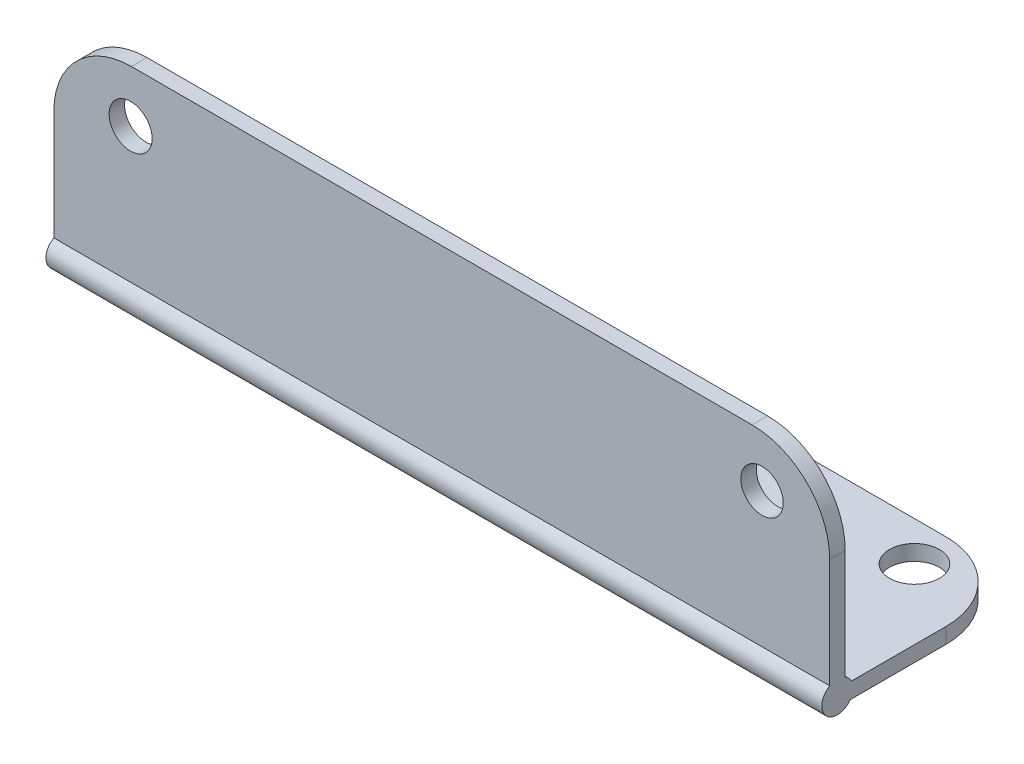
ISO-10303-21;
HEADER;
FILE_DESCRIPTION(('STEP AP214'),'2;1');
FILE_NAME('part.step','',(''),(''),'','','');
FILE_SCHEMA(('AUTOMOTIVE_DESIGN { 1 0 10303 214 1 1 1 1 }'));
ENDSEC;
DATA;
#1=APPLICATION_CONTEXT('core data for automotive mechanical design processes');
#2=APPLICATION_PROTOCOL_DEFINITION('international standard','automotive_design',2000,#1);
#3=PRODUCT_CONTEXT('',#1,'mechanical');
#4=PRODUCT('Part','Part','',(#3));
#5=PRODUCT_RELATED_PRODUCT_CATEGORY('part','',(#4));
#6=PRODUCT_DEFINITION_FORMATION('','',#4);
#7=PRODUCT_DEFINITION_CONTEXT('part definition',#1,'design');
#8=PRODUCT_DEFINITION('design','',#6,#7);
#9=PRODUCT_DEFINITION_SHAPE('','',#8);
#10=(LENGTH_UNIT() NAMED_UNIT(*) SI_UNIT(.MILLI.,.METRE.));
#11=(NAMED_UNIT(*) PLANE_ANGLE_UNIT() SI_UNIT($,.RADIAN.));
#12=(NAMED_UNIT(*) SI_UNIT($,.STERADIAN.) SOLID_ANGLE_UNIT());
#13=UNCERTAINTY_MEASURE_WITH_UNIT(LENGTH_MEASURE(1.E-05),#10,'distance_accuracy_value','');
#14=(GEOMETRIC_REPRESENTATION_CONTEXT(3) GLOBAL_UNCERTAINTY_ASSIGNED_CONTEXT((#13)) GLOBAL_UNIT_ASSIGNED_CONTEXT((#10,
#11,#12)) REPRESENTATION_CONTEXT('',''));
#15=CARTESIAN_POINT('',(0.,0.,0.));
#16=DIRECTION('',(0.,0.,1.));
#17=DIRECTION('',(1.,0.,0.));
#18=AXIS2_PLACEMENT_3D('',#15,#16,#17);
#19=CARTESIAN_POINT('',(25.4,-2.54,0.508));
#20=DIRECTION('',(-1.,0.,0.));
#21=DIRECTION('',(0.,0.,1.));
#22=AXIS2_PLACEMENT_3D('',#19,#20,#21);
#23=PLANE('',#22);
#24=DIRECTION('',(0.,0.,1.));
#25=VECTOR('',#24,1.);
#26=CARTESIAN_POINT('',(25.4,-6.35,0.508));
#27=LINE('',#26,#25);
#28=CARTESIAN_POINT('',(25.4,-6.35,-3.30199999999998));
#29=VERTEX_POINT('',#28);
#30=CARTESIAN_POINT('',(25.4,-6.35,-0.200131250913675));
#31=VERTEX_POINT('',#30);
#32=EDGE_CURVE('E134',#29,#31,#27,.T.);
#33=ORIENTED_EDGE('',*,*,#32,.T.);
#34=CARTESIAN_POINT('',(25.4,-6.57119429471253,0.257183830826068));
#35=DIRECTION('',(1.,0.,0.));
#36=DIRECTION('',(0.,0.,-1.));
#37=AXIS2_PLACEMENT_3D('',#34,#35,#36);
#38=CIRCLE('',#37,0.508);
#39=CARTESIAN_POINT('',(25.4,-6.13310700071551,0.));
#40=VERTEX_POINT('',#39);
#41=EDGE_CURVE('E117',#31,#40,#38,.T.);
#42=ORIENTED_EDGE('',*,*,#41,.T.);
#43=DIRECTION('',(0.,1.,0.));
#44=VECTOR('',#43,1.);
#45=CARTESIAN_POINT('',(25.4,-2.54,0.));
#46=LINE('',#45,#44);
#47=CARTESIAN_POINT('',(25.4,-2.54,0.));
#48=VERTEX_POINT('',#47);
#49=EDGE_CURVE('E165',#40,#48,#46,.T.);
#50=ORIENTED_EDGE('',*,*,#49,.T.);
#51=DIRECTION('',(0.,0.,-1.));
#52=VECTOR('',#51,1.);
#53=CARTESIAN_POINT('',(25.4,-2.54,0.508));
#54=LINE('',#53,#52);
#55=CARTESIAN_POINT('',(25.4,-2.54,0.508));
#56=VERTEX_POINT('',#55);
#57=EDGE_CURVE('E40',#56,#48,#54,.T.);
#58=ORIENTED_EDGE('',*,*,#57,.F.);
#59=DIRECTION('',(0.,1.,0.));
#60=VECTOR('',#59,1.);
#61=CARTESIAN_POINT('',(25.4,-2.54,0.508));
#62=LINE('',#61,#60);
#63=CARTESIAN_POINT('',(25.4,-6.12943050117472,0.508));
#64=VERTEX_POINT('',#63);
#65=EDGE_CURVE('E166',#64,#56,#62,.T.);
#66=ORIENTED_EDGE('',*,*,#65,.F.);
#67=CARTESIAN_POINT('',(25.4,-6.858,-0.162109011248007));
#68=VERTEX_POINT('',#67);
#69=EDGE_CURVE('E127',#64,#68,#38,.T.);
#70=ORIENTED_EDGE('',*,*,#69,.T.);
#71=DIRECTION('',(0.,0.,1.));
#72=VECTOR('',#71,1.);
#73=CARTESIAN_POINT('',(25.4,-6.858,0.508));
#74=LINE('',#73,#72);
#75=CARTESIAN_POINT('',(25.4,-6.858,-3.30199999999998));
#76=VERTEX_POINT('',#75);
#77=EDGE_CURVE('E154',#76,#68,#74,.T.);
#78=ORIENTED_EDGE('',*,*,#77,.F.);
#79=DIRECTION('',(0.,1.,0.));
#80=VECTOR('',#79,1.);
#81=CARTESIAN_POINT('',(25.4,-6.858,-3.30199999999998));
#82=LINE('',#81,#80);
#83=EDGE_CURVE('E140',#76,#29,#82,.T.);
#84=ORIENTED_EDGE('',*,*,#83,.T.);
#85=EDGE_LOOP('',(#33,#42,#50,#58,#66,#70,#78,#84));
#86=FACE_BOUND('',#85,.T.);
#87=ADVANCED_FACE('F33',(#86),#23,.F.);
#88=CARTESIAN_POINT('',(22.86,-2.54,0.508));
#89=DIRECTION('',(0.,0.,-1.));
#90=DIRECTION('',(-1.,0.,0.));
#91=AXIS2_PLACEMENT_3D('',#88,#89,#90);
#92=CYLINDRICAL_SURFACE('',#91,2.54);
#93=CARTESIAN_POINT('',(22.86,-2.54,0.));
#94=DIRECTION('',(0.,0.,1.));
#95=DIRECTION('',(1.,0.,0.));
#96=AXIS2_PLACEMENT_3D('',#93,#94,#95);
#97=CIRCLE('',#96,2.54);
#98=CARTESIAN_POINT('',(22.86,0.,0.));
#99=VERTEX_POINT('',#98);
#100=EDGE_CURVE('E178',#48,#99,#97,.T.);
#101=ORIENTED_EDGE('',*,*,#100,.T.);
#102=DIRECTION('',(0.,0.,-1.));
#103=VECTOR('',#102,1.);
#104=CARTESIAN_POINT('',(22.86,0.,0.508));
#105=LINE('',#104,#103);
#106=CARTESIAN_POINT('',(22.86,0.,0.508));
#107=VERTEX_POINT('',#106);
#108=EDGE_CURVE('E191',#107,#99,#105,.T.);
#109=ORIENTED_EDGE('',*,*,#108,.F.);
#110=CARTESIAN_POINT('',(22.86,-2.54,0.508));
#111=DIRECTION('',(0.,0.,1.));
#112=DIRECTION('',(1.,0.,0.));
#113=AXIS2_PLACEMENT_3D('',#110,#111,#112);
#114=CIRCLE('',#113,2.54);
#115=EDGE_CURVE('E168',#56,#107,#114,.T.);
#116=ORIENTED_EDGE('',*,*,#115,.F.);
#117=ORIENTED_EDGE('',*,*,#57,.T.);
#118=EDGE_LOOP('',(#101,#109,#116,#117));
#119=FACE_BOUND('',#118,.T.);
#120=ADVANCED_FACE('F197',(#119),#92,.T.);
#121=CARTESIAN_POINT('',(2.54,0.,0.508));
#122=DIRECTION('',(0.,-1.,0.));
#123=DIRECTION('',(1.,0.,0.));
#124=AXIS2_PLACEMENT_3D('',#121,#122,#123);
#125=PLANE('',#124);
#126=DIRECTION('',(-1.,0.,0.));
#127=VECTOR('',#126,1.);
#128=CARTESIAN_POINT('',(2.54,0.,0.));
#129=LINE('',#128,#127);
#130=CARTESIAN_POINT('',(2.54,0.,0.));
#131=VERTEX_POINT('',#130);
#132=EDGE_CURVE('E180',#99,#131,#129,.T.);
#133=ORIENTED_EDGE('',*,*,#132,.T.);
#134=DIRECTION('',(0.,0.,-1.));
#135=VECTOR('',#134,1.);
#136=CARTESIAN_POINT('',(2.54,0.,0.508));
#137=LINE('',#136,#135);
#138=CARTESIAN_POINT('',(2.54,0.,0.508));
#139=VERTEX_POINT('',#138);
#140=EDGE_CURVE('E188',#139,#131,#137,.T.);
#141=ORIENTED_EDGE('',*,*,#140,.F.);
#142=DIRECTION('',(-1.,0.,0.));
#143=VECTOR('',#142,1.);
#144=CARTESIAN_POINT('',(2.54,0.,0.508));
#145=LINE('',#144,#143);
#146=EDGE_CURVE('E171',#107,#139,#145,.T.);
#147=ORIENTED_EDGE('',*,*,#146,.F.);
#148=ORIENTED_EDGE('',*,*,#108,.T.);
#149=EDGE_LOOP('',(#133,#141,#147,#148));
#150=FACE_BOUND('',#149,.T.);
#151=ADVANCED_FACE('F209',(#150),#125,.F.);
#152=CARTESIAN_POINT('',(2.54,-2.54,0.508));
#153=DIRECTION('',(0.,0.,-1.));
#154=DIRECTION('',(-1.,0.,0.));
#155=AXIS2_PLACEMENT_3D('',#152,#153,#154);
#156=CYLINDRICAL_SURFACE('',#155,2.54);
#157=CARTESIAN_POINT('',(2.54,-2.54,0.));
#158=DIRECTION('',(0.,0.,1.));
#159=DIRECTION('',(-1.,0.,0.));
#160=AXIS2_PLACEMENT_3D('',#157,#158,#159);
#161=CIRCLE('',#160,2.54);
#162=CARTESIAN_POINT('',(0.,-2.54,0.));
#163=VERTEX_POINT('',#162);
#164=EDGE_CURVE('E182',#131,#163,#161,.T.);
#165=ORIENTED_EDGE('',*,*,#164,.T.);
#166=DIRECTION('',(0.,0.,-1.));
#167=VECTOR('',#166,1.);
#168=CARTESIAN_POINT('',(0.,-2.54,0.508));
#169=LINE('',#168,#167);
#170=CARTESIAN_POINT('',(0.,-2.54,0.508));
#171=VERTEX_POINT('',#170);
#172=EDGE_CURVE('E176',#171,#163,#169,.T.);
#173=ORIENTED_EDGE('',*,*,#172,.F.);
#174=CARTESIAN_POINT('',(2.54,-2.54,0.508));
#175=DIRECTION('',(0.,0.,1.));
#176=DIRECTION('',(-1.,0.,0.));
#177=AXIS2_PLACEMENT_3D('',#174,#175,#176);
#178=CIRCLE('',#177,2.54);
#179=EDGE_CURVE('E173',#139,#171,#178,.T.);
#180=ORIENTED_EDGE('',*,*,#179,.F.);
#181=ORIENTED_EDGE('',*,*,#140,.T.);
#182=EDGE_LOOP('',(#165,#173,#180,#181));
#183=FACE_BOUND('',#182,.T.);
#184=ADVANCED_FACE('F213',(#183),#156,.T.);
#185=CARTESIAN_POINT('',(0.,-2.54,0.508));
#186=DIRECTION('',(1.,0.,0.));
#187=DIRECTION('',(0.,1.,0.));
#188=AXIS2_PLACEMENT_3D('',#185,#186,#187);
#189=PLANE('',#188);
#190=DIRECTION('',(0.,-1.,0.));
#191=VECTOR('',#190,1.);
#192=CARTESIAN_POINT('',(0.,-2.54,0.));
#193=LINE('',#192,#191);
#194=CARTESIAN_POINT('',(0.,-6.13310700071551,0.));
#195=VERTEX_POINT('',#194);
#196=EDGE_CURVE('E169',#163,#195,#193,.T.);
#197=ORIENTED_EDGE('',*,*,#196,.T.);
#198=CARTESIAN_POINT('',(0.,-6.57119429471253,0.257183830826068));
#199=DIRECTION('',(1.,0.,0.));
#200=DIRECTION('',(0.,0.,-1.));
#201=AXIS2_PLACEMENT_3D('',#198,#199,#200);
#202=CIRCLE('',#201,0.508);
#203=CARTESIAN_POINT('',(0.,-6.35,-0.200131250913675));
#204=VERTEX_POINT('',#203);
#205=EDGE_CURVE('E379',#204,#195,#202,.T.);
#206=ORIENTED_EDGE('',*,*,#205,.F.);
#207=DIRECTION('',(0.,0.,-1.));
#208=VECTOR('',#207,1.);
#209=CARTESIAN_POINT('',(0.,-6.35,0.507999999999997));
#210=LINE('',#209,#208);
#211=CARTESIAN_POINT('',(0.,-6.35,-3.30199999999999));
#212=VERTEX_POINT('',#211);
#213=EDGE_CURVE('E136',#204,#212,#210,.T.);
#214=ORIENTED_EDGE('',*,*,#213,.T.);
#215=DIRECTION('',(0.,1.,0.));
#216=VECTOR('',#215,1.);
#217=CARTESIAN_POINT('',(0.,-6.858,-3.30199999999999));
#218=LINE('',#217,#216);
#219=CARTESIAN_POINT('',(0.,-6.858,-3.30199999999999));
#220=VERTEX_POINT('',#219);
#221=EDGE_CURVE('E162',#220,#212,#218,.T.);
#222=ORIENTED_EDGE('',*,*,#221,.F.);
#223=DIRECTION('',(0.,0.,-1.));
#224=VECTOR('',#223,1.);
#225=CARTESIAN_POINT('',(0.,-6.858,0.507999999999997));
#226=LINE('',#225,#224);
#227=CARTESIAN_POINT('',(0.,-6.858,-0.162109011248007));
#228=VERTEX_POINT('',#227);
#229=EDGE_CURVE('E372',#228,#220,#226,.T.);
#230=ORIENTED_EDGE('',*,*,#229,.F.);
#231=CARTESIAN_POINT('',(0.,-6.12943050117472,0.508));
#232=VERTEX_POINT('',#231);
#233=EDGE_CURVE('E126',#232,#228,#202,.T.);
#234=ORIENTED_EDGE('',*,*,#233,.F.);
#235=DIRECTION('',(0.,-1.,0.));
#236=VECTOR('',#235,1.);
#237=CARTESIAN_POINT('',(0.,-2.54,0.508));
#238=LINE('',#237,#236);
#239=EDGE_CURVE('E47',#171,#232,#238,.T.);
#240=ORIENTED_EDGE('',*,*,#239,.F.);
#241=ORIENTED_EDGE('',*,*,#172,.T.);
#242=EDGE_LOOP('',(#197,#206,#214,#222,#230,#234,#240,#241));
#243=FACE_BOUND('',#242,.T.);
#244=ADVANCED_FACE('F217',(#243),#189,.F.);
#245=CARTESIAN_POINT('',(2.54,-2.54,0.508));
#246=DIRECTION('',(0.,0.,-1.));
#247=DIRECTION('',(-1.,0.,0.));
#248=AXIS2_PLACEMENT_3D('',#245,#246,#247);
#249=PLANE('',#248);
#250=CARTESIAN_POINT('',(2.51357197906771,-1.70848159099695,0.508000000000002));
#251=DIRECTION('',(0.,0.,-1.));
#252=DIRECTION('',(-1.,0.,0.));
#253=AXIS2_PLACEMENT_3D('',#250,#251,#252);
#254=CIRCLE('',#253,0.705318584671743);
#255=CARTESIAN_POINT('',(1.80825339439596,-1.70848159099695,0.508000000000002));
#256=VERTEX_POINT('',#255);
#257=EDGE_CURVE('E388',#256,#256,#254,.T.);
#258=ORIENTED_EDGE('',*,*,#257,.T.);
#259=EDGE_LOOP('',(#258));
#260=FACE_BOUND('',#259,.T.);
#261=CARTESIAN_POINT('',(23.1848320375242,-1.70848159099695,0.508000000000002));
#262=DIRECTION('',(0.,0.,-1.));
#263=DIRECTION('',(-1.,0.,0.));
#264=AXIS2_PLACEMENT_3D('',#261,#262,#263);
#265=CIRCLE('',#264,0.694806542249764);
#266=CARTESIAN_POINT('',(22.4900254952744,-1.70848159099695,0.508000000000002));
#267=VERTEX_POINT('',#266);
#268=EDGE_CURVE('E382',#267,#267,#265,.T.);
#269=ORIENTED_EDGE('',*,*,#268,.T.);
#270=EDGE_LOOP('',(#269));
#271=FACE_BOUND('',#270,.T.);
#272=ORIENTED_EDGE('',*,*,#239,.T.);
#273=DIRECTION('',(1.,0.,0.));
#274=VECTOR('',#273,1.);
#275=CARTESIAN_POINT('',(0.,-6.12943050117472,0.508));
#276=LINE('',#275,#274);
#277=EDGE_CURVE('E51',#232,#64,#276,.T.);
#278=ORIENTED_EDGE('',*,*,#277,.T.);
#279=ORIENTED_EDGE('',*,*,#65,.T.);
#280=ORIENTED_EDGE('',*,*,#115,.T.);
#281=ORIENTED_EDGE('',*,*,#146,.T.);
#282=ORIENTED_EDGE('',*,*,#179,.T.);
#283=EDGE_LOOP('',(#272,#278,#279,#280,#281,#282));
#284=FACE_BOUND('',#283,.T.);
#285=ADVANCED_FACE('F215',(#260,#271,#284),#249,.F.);
#286=CARTESIAN_POINT('',(2.54,-2.54,0.));
#287=DIRECTION('',(0.,0.,-1.));
#288=DIRECTION('',(-1.,0.,0.));
#289=AXIS2_PLACEMENT_3D('',#286,#287,#288);
#290=PLANE('',#289);
#291=CARTESIAN_POINT('',(2.51357197906771,-1.70848159099695,0.));
#292=DIRECTION('',(0.,0.,-1.));
#293=DIRECTION('',(-1.,0.,0.));
#294=AXIS2_PLACEMENT_3D('',#291,#292,#293);
#295=CIRCLE('',#294,0.705318584671743);
#296=CARTESIAN_POINT('',(1.80825339439596,-1.70848159099695,0.));
#297=VERTEX_POINT('',#296);
#298=EDGE_CURVE('E390',#297,#297,#295,.T.);
#299=ORIENTED_EDGE('',*,*,#298,.F.);
#300=EDGE_LOOP('',(#299));
#301=FACE_BOUND('',#300,.T.);
#302=CARTESIAN_POINT('',(23.1848320375242,-1.70848159099695,0.));
#303=DIRECTION('',(0.,0.,-1.));
#304=DIRECTION('',(-1.,0.,0.));
#305=AXIS2_PLACEMENT_3D('',#302,#303,#304);
#306=CIRCLE('',#305,0.694806542249764);
#307=CARTESIAN_POINT('',(22.4900254952744,-1.70848159099695,0.));
#308=VERTEX_POINT('',#307);
#309=EDGE_CURVE('E385',#308,#308,#306,.T.);
#310=ORIENTED_EDGE('',*,*,#309,.F.);
#311=EDGE_LOOP('',(#310));
#312=FACE_BOUND('',#311,.T.);
#313=DIRECTION('',(1.,0.,0.));
#314=VECTOR('',#313,1.);
#315=CARTESIAN_POINT('',(0.,-6.13310700071551,0.));
#316=LINE('',#315,#314);
#317=EDGE_CURVE('E122',#195,#40,#316,.T.);
#318=ORIENTED_EDGE('',*,*,#317,.F.);
#319=ORIENTED_EDGE('',*,*,#196,.F.);
#320=ORIENTED_EDGE('',*,*,#164,.F.);
#321=ORIENTED_EDGE('',*,*,#132,.F.);
#322=ORIENTED_EDGE('',*,*,#100,.F.);
#323=ORIENTED_EDGE('',*,*,#49,.F.);
#324=EDGE_LOOP('',(#318,#319,#320,#321,#322,#323));
#325=FACE_BOUND('',#324,.T.);
#326=ADVANCED_FACE('F204',(#301,#312,#325),#290,.T.);
#327=CARTESIAN_POINT('',(2.54,-6.858,-3.302));
#328=DIRECTION('',(0.,1.,0.));
#329=DIRECTION('',(0.,0.,1.));
#330=AXIS2_PLACEMENT_3D('',#327,#328,#329);
#331=CYLINDRICAL_SURFACE('',#330,2.54);
#332=CARTESIAN_POINT('',(2.54,-6.35,-3.302));
#333=DIRECTION('',(0.,-1.,0.));
#334=DIRECTION('',(0.,0.,1.));
#335=AXIS2_PLACEMENT_3D('',#332,#333,#334);
#336=CIRCLE('',#335,2.54);
#337=CARTESIAN_POINT('',(2.54000000000002,-6.35,-5.842));
#338=VERTEX_POINT('',#337);
#339=EDGE_CURVE('E142',#212,#338,#336,.T.);
#340=ORIENTED_EDGE('',*,*,#339,.T.);
#341=DIRECTION('',(0.,1.,0.));
#342=VECTOR('',#341,1.);
#343=CARTESIAN_POINT('',(2.54000000000002,-6.858,-5.842));
#344=LINE('',#343,#342);
#345=CARTESIAN_POINT('',(2.54000000000002,-6.858,-5.842));
#346=VERTEX_POINT('',#345);
#347=EDGE_CURVE('E159',#346,#338,#344,.T.);
#348=ORIENTED_EDGE('',*,*,#347,.F.);
#349=CARTESIAN_POINT('',(2.54,-6.858,-3.302));
#350=DIRECTION('',(0.,-1.,0.));
#351=DIRECTION('',(0.,0.,1.));
#352=AXIS2_PLACEMENT_3D('',#349,#350,#351);
#353=CIRCLE('',#352,2.54);
#354=EDGE_CURVE('E371',#220,#346,#353,.T.);
#355=ORIENTED_EDGE('',*,*,#354,.F.);
#356=ORIENTED_EDGE('',*,*,#221,.T.);
#357=EDGE_LOOP('',(#340,#348,#355,#356));
#358=FACE_BOUND('',#357,.T.);
#359=ADVANCED_FACE('F224',(#358),#331,.T.);
#360=CARTESIAN_POINT('',(22.86,-6.858,-5.842));
#361=DIRECTION('',(0.,0.,1.));
#362=DIRECTION('',(1.,0.,0.));
#363=AXIS2_PLACEMENT_3D('',#360,#361,#362);
#364=PLANE('',#363);
#365=DIRECTION('',(1.,0.,0.));
#366=VECTOR('',#365,1.);
#367=CARTESIAN_POINT('',(22.86,-6.35,-5.842));
#368=LINE('',#367,#366);
#369=CARTESIAN_POINT('',(22.86,-6.35,-5.842));
#370=VERTEX_POINT('',#369);
#371=EDGE_CURVE('E150',#338,#370,#368,.T.);
#372=ORIENTED_EDGE('',*,*,#371,.T.);
#373=DIRECTION('',(0.,1.,0.));
#374=VECTOR('',#373,1.);
#375=CARTESIAN_POINT('',(22.86,-6.858,-5.842));
#376=LINE('',#375,#374);
#377=CARTESIAN_POINT('',(22.86,-6.858,-5.842));
#378=VERTEX_POINT('',#377);
#379=EDGE_CURVE('E156',#378,#370,#376,.T.);
#380=ORIENTED_EDGE('',*,*,#379,.F.);
#381=DIRECTION('',(1.,0.,0.));
#382=VECTOR('',#381,1.);
#383=CARTESIAN_POINT('',(22.86,-6.858,-5.842));
#384=LINE('',#383,#382);
#385=EDGE_CURVE('E368',#346,#378,#384,.T.);
#386=ORIENTED_EDGE('',*,*,#385,.F.);
#387=ORIENTED_EDGE('',*,*,#347,.T.);
#388=EDGE_LOOP('',(#372,#380,#386,#387));
#389=FACE_BOUND('',#388,.T.);
#390=ADVANCED_FACE('F356',(#389),#364,.F.);
#391=CARTESIAN_POINT('',(22.86,-6.858,-3.302));
#392=DIRECTION('',(0.,1.,0.));
#393=DIRECTION('',(0.,0.,1.));
#394=AXIS2_PLACEMENT_3D('',#391,#392,#393);
#395=CYLINDRICAL_SURFACE('',#394,2.54);
#396=CARTESIAN_POINT('',(22.86,-6.35,-3.302));
#397=DIRECTION('',(0.,-1.,0.));
#398=DIRECTION('',(0.,0.,1.));
#399=AXIS2_PLACEMENT_3D('',#396,#397,#398);
#400=CIRCLE('',#399,2.54);
#401=EDGE_CURVE('E152',#370,#29,#400,.T.);
#402=ORIENTED_EDGE('',*,*,#401,.T.);
#403=ORIENTED_EDGE('',*,*,#83,.F.);
#404=CARTESIAN_POINT('',(22.86,-6.858,-3.302));
#405=DIRECTION('',(0.,-1.,0.));
#406=DIRECTION('',(0.,0.,1.));
#407=AXIS2_PLACEMENT_3D('',#404,#405,#406);
#408=CIRCLE('',#407,2.54);
#409=EDGE_CURVE('E146',#378,#76,#408,.T.);
#410=ORIENTED_EDGE('',*,*,#409,.F.);
#411=ORIENTED_EDGE('',*,*,#379,.T.);
#412=EDGE_LOOP('',(#402,#403,#410,#411));
#413=FACE_BOUND('',#412,.T.);
#414=ADVANCED_FACE('F320',(#413),#395,.T.);
#415=CARTESIAN_POINT('',(22.86,-6.858,-3.302));
#416=DIRECTION('',(0.,1.,0.));
#417=DIRECTION('',(0.,0.,1.));
#418=AXIS2_PLACEMENT_3D('',#415,#416,#417);
#419=PLANE('',#418);
#420=CARTESIAN_POINT('',(23.1090342258231,-6.858,-4.5578209509475));
#421=DIRECTION('',(0.,1.,0.));
#422=DIRECTION('',(0.,0.,1.));
#423=AXIS2_PLACEMENT_3D('',#420,#421,#422);
#424=CIRCLE('',#423,0.81840386223556);
#425=CARTESIAN_POINT('',(23.1090342258231,-6.858,-3.73941708871194));
#426=VERTEX_POINT('',#425);
#427=EDGE_CURVE('E399',#426,#426,#424,.T.);
#428=ORIENTED_EDGE('',*,*,#427,.T.);
#429=EDGE_LOOP('',(#428));
#430=FACE_BOUND('',#429,.T.);
#431=CARTESIAN_POINT('',(2.57181661332228,-6.858,-3.78468368329439));
#432=DIRECTION('',(0.,1.,0.));
#433=DIRECTION('',(0.,0.,1.));
#434=AXIS2_PLACEMENT_3D('',#431,#432,#433);
#435=CIRCLE('',#434,0.773137267653106);
#436=CARTESIAN_POINT('',(2.57181661332228,-6.858,-3.01154641564128));
#437=VERTEX_POINT('',#436);
#438=EDGE_CURVE('E393',#437,#437,#435,.T.);
#439=ORIENTED_EDGE('',*,*,#438,.T.);
#440=EDGE_LOOP('',(#439));
#441=FACE_BOUND('',#440,.T.);
#442=ORIENTED_EDGE('',*,*,#77,.T.);
#443=DIRECTION('',(1.,0.,0.));
#444=VECTOR('',#443,1.);
#445=CARTESIAN_POINT('',(0.,-6.858,-0.162109011248007));
#446=LINE('',#445,#444);
#447=EDGE_CURVE('E378',#68,#228,#446,.F.);
#448=ORIENTED_EDGE('',*,*,#447,.T.);
#449=ORIENTED_EDGE('',*,*,#229,.T.);
#450=ORIENTED_EDGE('',*,*,#354,.T.);
#451=ORIENTED_EDGE('',*,*,#385,.T.);
#452=ORIENTED_EDGE('',*,*,#409,.T.);
#453=EDGE_LOOP('',(#442,#448,#449,#450,#451,#452));
#454=FACE_BOUND('',#453,.T.);
#455=ADVANCED_FACE('F315',(#430,#441,#454),#419,.F.);
#456=CARTESIAN_POINT('',(22.86,-6.35,-3.302));
#457=DIRECTION('',(0.,1.,0.));
#458=DIRECTION('',(0.,0.,1.));
#459=AXIS2_PLACEMENT_3D('',#456,#457,#458);
#460=PLANE('',#459);
#461=CARTESIAN_POINT('',(23.1090342258231,-6.35,-4.5578209509475));
#462=DIRECTION('',(0.,1.,0.));
#463=DIRECTION('',(0.,0.,1.));
#464=AXIS2_PLACEMENT_3D('',#461,#462,#463);
#465=CIRCLE('',#464,0.81840386223556);
#466=CARTESIAN_POINT('',(23.1090342258231,-6.35,-3.73941708871194));
#467=VERTEX_POINT('',#466);
#468=EDGE_CURVE('E402',#467,#467,#465,.T.);
#469=ORIENTED_EDGE('',*,*,#468,.F.);
#470=EDGE_LOOP('',(#469));
#471=FACE_BOUND('',#470,.T.);
#472=CARTESIAN_POINT('',(2.57181661332228,-6.35,-3.78468368329439));
#473=DIRECTION('',(0.,1.,0.));
#474=DIRECTION('',(0.,0.,1.));
#475=AXIS2_PLACEMENT_3D('',#472,#473,#474);
#476=CIRCLE('',#475,0.773137267653106);
#477=CARTESIAN_POINT('',(2.57181661332228,-6.35,-3.01154641564128));
#478=VERTEX_POINT('',#477);
#479=EDGE_CURVE('E396',#478,#478,#476,.T.);
#480=ORIENTED_EDGE('',*,*,#479,.F.);
#481=EDGE_LOOP('',(#480));
#482=FACE_BOUND('',#481,.T.);
#483=DIRECTION('',(1.,0.,0.));
#484=VECTOR('',#483,1.);
#485=CARTESIAN_POINT('',(0.,-6.35,-0.200131250913675));
#486=LINE('',#485,#484);
#487=EDGE_CURVE('E11',#31,#204,#486,.F.);
#488=ORIENTED_EDGE('',*,*,#487,.F.);
#489=ORIENTED_EDGE('',*,*,#32,.F.);
#490=ORIENTED_EDGE('',*,*,#401,.F.);
#491=ORIENTED_EDGE('',*,*,#371,.F.);
#492=ORIENTED_EDGE('',*,*,#339,.F.);
#493=ORIENTED_EDGE('',*,*,#213,.F.);
#494=EDGE_LOOP('',(#488,#489,#490,#491,#492,#493));
#495=FACE_BOUND('',#494,.T.);
#496=ADVANCED_FACE('F132',(#471,#482,#495),#460,.T.);
#497=CARTESIAN_POINT('',(0.,-6.57119429471253,0.257183830826068));
#498=DIRECTION('',(1.,0.,0.));
#499=DIRECTION('',(0.,0.,-1.));
#500=AXIS2_PLACEMENT_3D('',#497,#498,#499);
#501=CYLINDRICAL_SURFACE('',#500,0.508);
#502=ORIENTED_EDGE('',*,*,#205,.T.);
#503=ORIENTED_EDGE('',*,*,#317,.T.);
#504=ORIENTED_EDGE('',*,*,#41,.F.);
#505=ORIENTED_EDGE('',*,*,#487,.T.);
#506=EDGE_LOOP('',(#502,#503,#504,#505));
#507=FACE_BOUND('',#506,.T.);
#508=ADVANCED_FACE('F119',(#507),#501,.T.);
#509=ORIENTED_EDGE('',*,*,#277,.F.);
#510=ORIENTED_EDGE('',*,*,#233,.T.);
#511=ORIENTED_EDGE('',*,*,#447,.F.);
#512=ORIENTED_EDGE('',*,*,#69,.F.);
#513=EDGE_LOOP('',(#509,#510,#511,#512));
#514=FACE_BOUND('',#513,.T.);
#515=ADVANCED_FACE('F264',(#514),#501,.T.);
#516=CARTESIAN_POINT('',(23.1848320375242,-1.70848159099695,25.4));
#517=DIRECTION('',(0.,0.,-1.));
#518=DIRECTION('',(-1.,0.,0.));
#519=AXIS2_PLACEMENT_3D('',#516,#517,#518);
#520=CYLINDRICAL_SURFACE('',#519,0.694806542249764);
#521=ORIENTED_EDGE('',*,*,#309,.T.);
#522=EDGE_LOOP('',(#521));
#523=FACE_BOUND('',#522,.T.);
#524=ORIENTED_EDGE('',*,*,#268,.F.);
#525=EDGE_LOOP('',(#524));
#526=FACE_BOUND('',#525,.T.);
#527=ADVANCED_FACE('F273',(#523,#526),#520,.F.);
#528=CARTESIAN_POINT('',(2.51357197906771,-1.70848159099695,25.4));
#529=DIRECTION('',(0.,0.,-1.));
#530=DIRECTION('',(-1.,0.,0.));
#531=AXIS2_PLACEMENT_3D('',#528,#529,#530);
#532=CYLINDRICAL_SURFACE('',#531,0.705318584671743);
#533=ORIENTED_EDGE('',*,*,#298,.T.);
#534=EDGE_LOOP('',(#533));
#535=FACE_BOUND('',#534,.T.);
#536=ORIENTED_EDGE('',*,*,#257,.F.);
#537=EDGE_LOOP('',(#536));
#538=FACE_BOUND('',#537,.T.);
#539=ADVANCED_FACE('F297',(#535,#538),#532,.F.);
#540=CARTESIAN_POINT('',(2.57181661332228,-31.75,-3.78468368329439));
#541=DIRECTION('',(0.,1.,0.));
#542=DIRECTION('',(0.,0.,1.));
#543=AXIS2_PLACEMENT_3D('',#540,#541,#542);
#544=CYLINDRICAL_SURFACE('',#543,0.773137267653106);
#545=ORIENTED_EDGE('',*,*,#479,.T.);
#546=EDGE_LOOP('',(#545));
#547=FACE_BOUND('',#546,.T.);
#548=ORIENTED_EDGE('',*,*,#438,.F.);
#549=EDGE_LOOP('',(#548));
#550=FACE_BOUND('',#549,.T.);
#551=ADVANCED_FACE('F307',(#547,#550),#544,.F.);
#552=CARTESIAN_POINT('',(23.1090342258231,-31.75,-4.5578209509475));
#553=DIRECTION('',(0.,1.,0.));
#554=DIRECTION('',(0.,0.,1.));
#555=AXIS2_PLACEMENT_3D('',#552,#553,#554);
#556=CYLINDRICAL_SURFACE('',#555,0.81840386223556);
#557=ORIENTED_EDGE('',*,*,#468,.T.);
#558=EDGE_LOOP('',(#557));
#559=FACE_BOUND('',#558,.T.);
#560=ORIENTED_EDGE('',*,*,#427,.F.);
#561=EDGE_LOOP('',(#560));
#562=FACE_BOUND('',#561,.T.);
#563=ADVANCED_FACE('F338',(#559,#562),#556,.F.);
#564=CLOSED_SHELL('',(#87,#120,#151,#184,#244,#285,#326,#359,#390,#414,#455,#496,#508,#515,#527,
#539,#551,#563));
#565=MANIFOLD_SOLID_BREP('B2',#564);
#566=ADVANCED_BREP_SHAPE_REPRESENTATION('',(#18,#565),#14);
#567=SHAPE_DEFINITION_REPRESENTATION(#9,#566);
ENDSEC;
END-ISO-10303-21;
